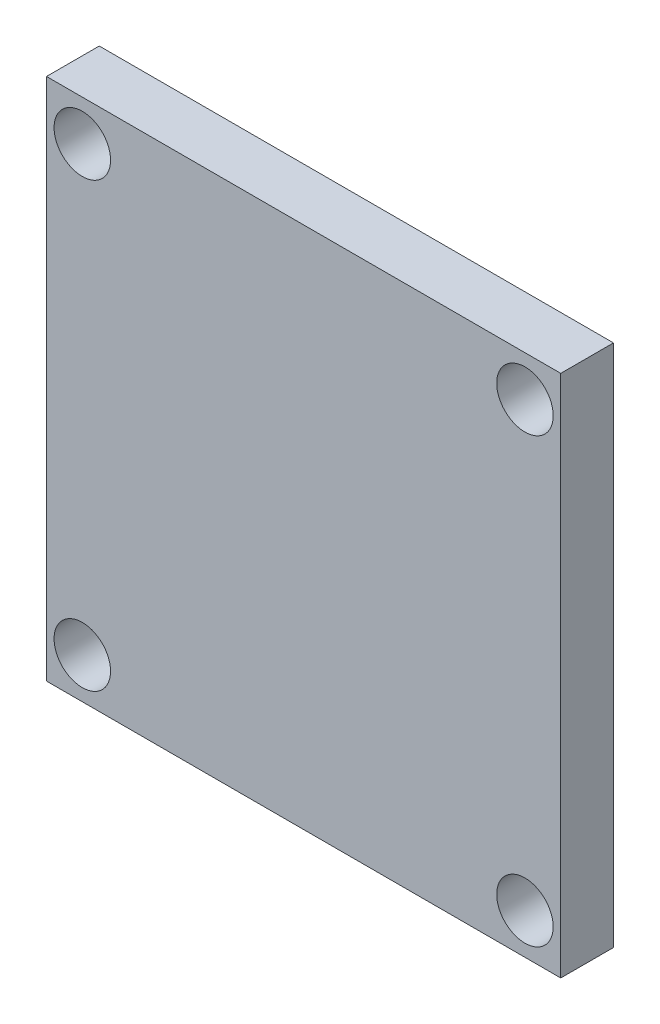
ISO-10303-21;
HEADER;
FILE_DESCRIPTION(('STEP AP214'),'2;1');
FILE_NAME('part.step','',(''),(''),'','','');
FILE_SCHEMA(('AUTOMOTIVE_DESIGN { 1 0 10303 214 1 1 1 1 }'));
ENDSEC;
DATA;
#1=APPLICATION_CONTEXT('core data for automotive mechanical design processes');
#2=APPLICATION_PROTOCOL_DEFINITION('international standard','automotive_design',2000,#1);
#3=PRODUCT_CONTEXT('',#1,'mechanical');
#4=PRODUCT('Part','Part','',(#3));
#5=PRODUCT_RELATED_PRODUCT_CATEGORY('part','',(#4));
#6=PRODUCT_DEFINITION_FORMATION('','',#4);
#7=PRODUCT_DEFINITION_CONTEXT('part definition',#1,'design');
#8=PRODUCT_DEFINITION('design','',#6,#7);
#9=PRODUCT_DEFINITION_SHAPE('','',#8);
#10=(LENGTH_UNIT() NAMED_UNIT(*) SI_UNIT(.MILLI.,.METRE.));
#11=(NAMED_UNIT(*) PLANE_ANGLE_UNIT() SI_UNIT($,.RADIAN.));
#12=(NAMED_UNIT(*) SI_UNIT($,.STERADIAN.) SOLID_ANGLE_UNIT());
#13=UNCERTAINTY_MEASURE_WITH_UNIT(LENGTH_MEASURE(1.E-05),#10,'distance_accuracy_value','');
#14=(GEOMETRIC_REPRESENTATION_CONTEXT(3) GLOBAL_UNCERTAINTY_ASSIGNED_CONTEXT((#13)) GLOBAL_UNIT_ASSIGNED_CONTEXT((#10,
#11,#12)) REPRESENTATION_CONTEXT('',''));
#15=CARTESIAN_POINT('',(0.,0.,0.));
#16=DIRECTION('',(0.,0.,1.));
#17=DIRECTION('',(1.,0.,0.));
#18=AXIS2_PLACEMENT_3D('',#15,#16,#17);
#19=CARTESIAN_POINT('',(0.,0.,2.8));
#20=DIRECTION('',(1.,0.,0.));
#21=DIRECTION('',(0.,0.,-1.));
#22=AXIS2_PLACEMENT_3D('',#19,#20,#21);
#23=PLANE('',#22);
#24=DIRECTION('',(0.,-1.,0.));
#25=VECTOR('',#24,1.);
#26=CARTESIAN_POINT('',(0.,0.,0.));
#27=LINE('',#26,#25);
#28=CARTESIAN_POINT('',(0.,27.8,0.));
#29=VERTEX_POINT('',#28);
#30=CARTESIAN_POINT('',(0.,0.,0.));
#31=VERTEX_POINT('',#30);
#32=EDGE_CURVE('E102',#29,#31,#27,.T.);
#33=ORIENTED_EDGE('',*,*,#32,.T.);
#34=DIRECTION('',(0.,0.,-1.));
#35=VECTOR('',#34,1.);
#36=CARTESIAN_POINT('',(0.,0.,2.8));
#37=LINE('',#36,#35);
#38=CARTESIAN_POINT('',(0.,0.,2.8));
#39=VERTEX_POINT('',#38);
#40=EDGE_CURVE('E11',#39,#31,#37,.T.);
#41=ORIENTED_EDGE('',*,*,#40,.F.);
#42=DIRECTION('',(0.,-1.,0.));
#43=VECTOR('',#42,1.);
#44=CARTESIAN_POINT('',(0.,0.,2.8));
#45=LINE('',#44,#43);
#46=CARTESIAN_POINT('',(0.,27.8,2.8));
#47=VERTEX_POINT('',#46);
#48=EDGE_CURVE('E90',#47,#39,#45,.T.);
#49=ORIENTED_EDGE('',*,*,#48,.F.);
#50=DIRECTION('',(0.,0.,-1.));
#51=VECTOR('',#50,1.);
#52=CARTESIAN_POINT('',(0.,27.8,2.8));
#53=LINE('',#52,#51);
#54=EDGE_CURVE('E98',#47,#29,#53,.T.);
#55=ORIENTED_EDGE('',*,*,#54,.T.);
#56=EDGE_LOOP('',(#33,#41,#49,#55));
#57=FACE_BOUND('',#56,.T.);
#58=ADVANCED_FACE('F39',(#57),#23,.F.);
#59=CARTESIAN_POINT('',(0.,0.,2.8));
#60=DIRECTION('',(0.,1.,0.));
#61=DIRECTION('',(0.,0.,1.));
#62=AXIS2_PLACEMENT_3D('',#59,#60,#61);
#63=PLANE('',#62);
#64=DIRECTION('',(1.,0.,0.));
#65=VECTOR('',#64,1.);
#66=CARTESIAN_POINT('',(0.,0.,0.));
#67=LINE('',#66,#65);
#68=CARTESIAN_POINT('',(27.3,0.,0.));
#69=VERTEX_POINT('',#68);
#70=EDGE_CURVE('E94',#31,#69,#67,.T.);
#71=ORIENTED_EDGE('',*,*,#70,.T.);
#72=DIRECTION('',(0.,0.,-1.));
#73=VECTOR('',#72,1.);
#74=CARTESIAN_POINT('',(27.3,0.,2.8));
#75=LINE('',#74,#73);
#76=CARTESIAN_POINT('',(27.3,0.,2.8));
#77=VERTEX_POINT('',#76);
#78=EDGE_CURVE('E47',#77,#69,#75,.T.);
#79=ORIENTED_EDGE('',*,*,#78,.F.);
#80=DIRECTION('',(1.,0.,0.));
#81=VECTOR('',#80,1.);
#82=CARTESIAN_POINT('',(0.,0.,2.8));
#83=LINE('',#82,#81);
#84=EDGE_CURVE('E85',#39,#77,#83,.T.);
#85=ORIENTED_EDGE('',*,*,#84,.F.);
#86=ORIENTED_EDGE('',*,*,#40,.T.);
#87=EDGE_LOOP('',(#71,#79,#85,#86));
#88=FACE_BOUND('',#87,.T.);
#89=ADVANCED_FACE('F93',(#88),#63,.F.);
#90=CARTESIAN_POINT('',(27.3,0.,2.8));
#91=DIRECTION('',(-1.,0.,0.));
#92=DIRECTION('',(0.,0.,1.));
#93=AXIS2_PLACEMENT_3D('',#90,#91,#92);
#94=PLANE('',#93);
#95=DIRECTION('',(0.,1.,0.));
#96=VECTOR('',#95,1.);
#97=CARTESIAN_POINT('',(27.3,0.,0.));
#98=LINE('',#97,#96);
#99=CARTESIAN_POINT('',(27.3,27.8,0.));
#100=VERTEX_POINT('',#99);
#101=EDGE_CURVE('E72',#69,#100,#98,.T.);
#102=ORIENTED_EDGE('',*,*,#101,.T.);
#103=DIRECTION('',(0.,0.,-1.));
#104=VECTOR('',#103,1.);
#105=CARTESIAN_POINT('',(27.3,27.8,2.8));
#106=LINE('',#105,#104);
#107=CARTESIAN_POINT('',(27.3,27.8,2.8));
#108=VERTEX_POINT('',#107);
#109=EDGE_CURVE('E95',#108,#100,#106,.T.);
#110=ORIENTED_EDGE('',*,*,#109,.F.);
#111=DIRECTION('',(0.,1.,0.));
#112=VECTOR('',#111,1.);
#113=CARTESIAN_POINT('',(27.3,0.,2.8));
#114=LINE('',#113,#112);
#115=EDGE_CURVE('E88',#77,#108,#114,.T.);
#116=ORIENTED_EDGE('',*,*,#115,.F.);
#117=ORIENTED_EDGE('',*,*,#78,.T.);
#118=EDGE_LOOP('',(#102,#110,#116,#117));
#119=FACE_BOUND('',#118,.T.);
#120=ADVANCED_FACE('F96',(#119),#94,.F.);
#121=CARTESIAN_POINT('',(0.,27.8,2.8));
#122=DIRECTION('',(0.,-1.,0.));
#123=DIRECTION('',(0.,0.,-1.));
#124=AXIS2_PLACEMENT_3D('',#121,#122,#123);
#125=PLANE('',#124);
#126=DIRECTION('',(-1.,0.,0.));
#127=VECTOR('',#126,1.);
#128=CARTESIAN_POINT('',(0.,27.8,0.));
#129=LINE('',#128,#127);
#130=EDGE_CURVE('E78',#100,#29,#129,.T.);
#131=ORIENTED_EDGE('',*,*,#130,.T.);
#132=ORIENTED_EDGE('',*,*,#54,.F.);
#133=DIRECTION('',(-1.,0.,0.));
#134=VECTOR('',#133,1.);
#135=CARTESIAN_POINT('',(0.,27.8,2.8));
#136=LINE('',#135,#134);
#137=EDGE_CURVE('E55',#108,#47,#136,.T.);
#138=ORIENTED_EDGE('',*,*,#137,.F.);
#139=ORIENTED_EDGE('',*,*,#109,.T.);
#140=EDGE_LOOP('',(#131,#132,#138,#139));
#141=FACE_BOUND('',#140,.T.);
#142=ADVANCED_FACE('F110',(#141),#125,.F.);
#143=CARTESIAN_POINT('',(0.,0.,2.8));
#144=DIRECTION('',(0.,0.,-1.));
#145=DIRECTION('',(-1.,0.,0.));
#146=AXIS2_PLACEMENT_3D('',#143,#144,#145);
#147=PLANE('',#146);
#148=CARTESIAN_POINT('',(1.9,2.15,2.8));
#149=DIRECTION('',(0.,0.,1.));
#150=DIRECTION('',(1.,0.,0.));
#151=AXIS2_PLACEMENT_3D('',#148,#149,#150);
#152=CIRCLE('',#151,1.5);
#153=CARTESIAN_POINT('',(3.4,2.15,2.8));
#154=VERTEX_POINT('',#153);
#155=EDGE_CURVE('E125',#154,#154,#152,.T.);
#156=ORIENTED_EDGE('',*,*,#155,.F.);
#157=EDGE_LOOP('',(#156));
#158=FACE_BOUND('',#157,.T.);
#159=CARTESIAN_POINT('',(25.4,2.15,2.8));
#160=DIRECTION('',(0.,0.,1.));
#161=DIRECTION('',(1.,0.,0.));
#162=AXIS2_PLACEMENT_3D('',#159,#160,#161);
#163=CIRCLE('',#162,1.5);
#164=CARTESIAN_POINT('',(26.9,2.15,2.8));
#165=VERTEX_POINT('',#164);
#166=EDGE_CURVE('E131',#165,#165,#163,.T.);
#167=ORIENTED_EDGE('',*,*,#166,.F.);
#168=EDGE_LOOP('',(#167));
#169=FACE_BOUND('',#168,.T.);
#170=CARTESIAN_POINT('',(25.4,25.65,2.8));
#171=DIRECTION('',(0.,0.,1.));
#172=DIRECTION('',(1.,0.,0.));
#173=AXIS2_PLACEMENT_3D('',#170,#171,#172);
#174=CIRCLE('',#173,1.5);
#175=CARTESIAN_POINT('',(26.9,25.65,2.8));
#176=VERTEX_POINT('',#175);
#177=EDGE_CURVE('E119',#176,#176,#174,.T.);
#178=ORIENTED_EDGE('',*,*,#177,.F.);
#179=EDGE_LOOP('',(#178));
#180=FACE_BOUND('',#179,.T.);
#181=CARTESIAN_POINT('',(1.9,25.65,2.8));
#182=DIRECTION('',(0.,0.,1.));
#183=DIRECTION('',(1.,0.,0.));
#184=AXIS2_PLACEMENT_3D('',#181,#182,#183);
#185=CIRCLE('',#184,1.5);
#186=CARTESIAN_POINT('',(3.4,25.65,2.8));
#187=VERTEX_POINT('',#186);
#188=EDGE_CURVE('E116',#187,#187,#185,.T.);
#189=ORIENTED_EDGE('',*,*,#188,.F.);
#190=EDGE_LOOP('',(#189));
#191=FACE_BOUND('',#190,.T.);
#192=ORIENTED_EDGE('',*,*,#48,.T.);
#193=ORIENTED_EDGE('',*,*,#84,.T.);
#194=ORIENTED_EDGE('',*,*,#115,.T.);
#195=ORIENTED_EDGE('',*,*,#137,.T.);
#196=EDGE_LOOP('',(#192,#193,#194,#195));
#197=FACE_BOUND('',#196,.T.);
#198=ADVANCED_FACE('F86',(#158,#169,#180,#191,#197),#147,.F.);
#199=CARTESIAN_POINT('',(0.,0.,0.));
#200=DIRECTION('',(0.,0.,-1.));
#201=DIRECTION('',(-1.,0.,0.));
#202=AXIS2_PLACEMENT_3D('',#199,#200,#201);
#203=PLANE('',#202);
#204=CARTESIAN_POINT('',(1.9,2.15,0.));
#205=DIRECTION('',(0.,0.,1.));
#206=DIRECTION('',(1.,0.,0.));
#207=AXIS2_PLACEMENT_3D('',#204,#205,#206);
#208=CIRCLE('',#207,1.5);
#209=CARTESIAN_POINT('',(3.4,2.15,0.));
#210=VERTEX_POINT('',#209);
#211=EDGE_CURVE('E122',#210,#210,#208,.T.);
#212=ORIENTED_EDGE('',*,*,#211,.T.);
#213=EDGE_LOOP('',(#212));
#214=FACE_BOUND('',#213,.T.);
#215=CARTESIAN_POINT('',(25.4,2.15,0.));
#216=DIRECTION('',(0.,0.,1.));
#217=DIRECTION('',(1.,0.,0.));
#218=AXIS2_PLACEMENT_3D('',#215,#216,#217);
#219=CIRCLE('',#218,1.5);
#220=CARTESIAN_POINT('',(26.9,2.15,0.));
#221=VERTEX_POINT('',#220);
#222=EDGE_CURVE('E128',#221,#221,#219,.T.);
#223=ORIENTED_EDGE('',*,*,#222,.T.);
#224=EDGE_LOOP('',(#223));
#225=FACE_BOUND('',#224,.T.);
#226=CARTESIAN_POINT('',(25.4,25.65,0.));
#227=DIRECTION('',(0.,0.,1.));
#228=DIRECTION('',(1.,0.,0.));
#229=AXIS2_PLACEMENT_3D('',#226,#227,#228);
#230=CIRCLE('',#229,1.5);
#231=CARTESIAN_POINT('',(26.9,25.65,0.));
#232=VERTEX_POINT('',#231);
#233=EDGE_CURVE('E134',#232,#232,#230,.T.);
#234=ORIENTED_EDGE('',*,*,#233,.T.);
#235=EDGE_LOOP('',(#234));
#236=FACE_BOUND('',#235,.T.);
#237=CARTESIAN_POINT('',(1.9,25.65,0.));
#238=DIRECTION('',(0.,0.,1.));
#239=DIRECTION('',(1.,0.,0.));
#240=AXIS2_PLACEMENT_3D('',#237,#238,#239);
#241=CIRCLE('',#240,1.5);
#242=CARTESIAN_POINT('',(3.4,25.65,0.));
#243=VERTEX_POINT('',#242);
#244=EDGE_CURVE('E105',#243,#243,#241,.T.);
#245=ORIENTED_EDGE('',*,*,#244,.T.);
#246=EDGE_LOOP('',(#245));
#247=FACE_BOUND('',#246,.T.);
#248=ORIENTED_EDGE('',*,*,#32,.F.);
#249=ORIENTED_EDGE('',*,*,#130,.F.);
#250=ORIENTED_EDGE('',*,*,#101,.F.);
#251=ORIENTED_EDGE('',*,*,#70,.F.);
#252=EDGE_LOOP('',(#248,#249,#250,#251));
#253=FACE_BOUND('',#252,.T.);
#254=ADVANCED_FACE('F113',(#214,#225,#236,#247,#253),#203,.T.);
#255=CARTESIAN_POINT('',(1.9,25.65,0.));
#256=DIRECTION('',(0.,0.,1.));
#257=DIRECTION('',(1.,0.,0.));
#258=AXIS2_PLACEMENT_3D('',#255,#256,#257);
#259=CYLINDRICAL_SURFACE('',#258,1.5);
#260=ORIENTED_EDGE('',*,*,#244,.F.);
#261=EDGE_LOOP('',(#260));
#262=FACE_BOUND('',#261,.T.);
#263=ORIENTED_EDGE('',*,*,#188,.T.);
#264=EDGE_LOOP('',(#263));
#265=FACE_BOUND('',#264,.T.);
#266=ADVANCED_FACE('F148',(#262,#265),#259,.F.);
#267=CARTESIAN_POINT('',(25.4,25.65,0.));
#268=DIRECTION('',(0.,0.,1.));
#269=DIRECTION('',(1.,0.,0.));
#270=AXIS2_PLACEMENT_3D('',#267,#268,#269);
#271=CYLINDRICAL_SURFACE('',#270,1.5);
#272=ORIENTED_EDGE('',*,*,#233,.F.);
#273=EDGE_LOOP('',(#272));
#274=FACE_BOUND('',#273,.T.);
#275=ORIENTED_EDGE('',*,*,#177,.T.);
#276=EDGE_LOOP('',(#275));
#277=FACE_BOUND('',#276,.T.);
#278=ADVANCED_FACE('F140',(#274,#277),#271,.F.);
#279=CARTESIAN_POINT('',(25.4,2.15,0.));
#280=DIRECTION('',(0.,0.,1.));
#281=DIRECTION('',(1.,0.,0.));
#282=AXIS2_PLACEMENT_3D('',#279,#280,#281);
#283=CYLINDRICAL_SURFACE('',#282,1.5);
#284=ORIENTED_EDGE('',*,*,#222,.F.);
#285=EDGE_LOOP('',(#284));
#286=FACE_BOUND('',#285,.T.);
#287=ORIENTED_EDGE('',*,*,#166,.T.);
#288=EDGE_LOOP('',(#287));
#289=FACE_BOUND('',#288,.T.);
#290=ADVANCED_FACE('F156',(#286,#289),#283,.F.);
#291=CARTESIAN_POINT('',(1.9,2.15,0.));
#292=DIRECTION('',(0.,0.,1.));
#293=DIRECTION('',(1.,0.,0.));
#294=AXIS2_PLACEMENT_3D('',#291,#292,#293);
#295=CYLINDRICAL_SURFACE('',#294,1.5);
#296=ORIENTED_EDGE('',*,*,#211,.F.);
#297=EDGE_LOOP('',(#296));
#298=FACE_BOUND('',#297,.T.);
#299=ORIENTED_EDGE('',*,*,#155,.T.);
#300=EDGE_LOOP('',(#299));
#301=FACE_BOUND('',#300,.T.);
#302=ADVANCED_FACE('F207',(#298,#301),#295,.F.);
#303=CLOSED_SHELL('',(#58,#89,#120,#142,#198,#254,#266,#278,#290,#302));
#304=MANIFOLD_SOLID_BREP('B2',#303);
#305=ADVANCED_BREP_SHAPE_REPRESENTATION('',(#18,#304),#14);
#306=SHAPE_DEFINITION_REPRESENTATION(#9,#305);
ENDSEC;
END-ISO-10303-21;
